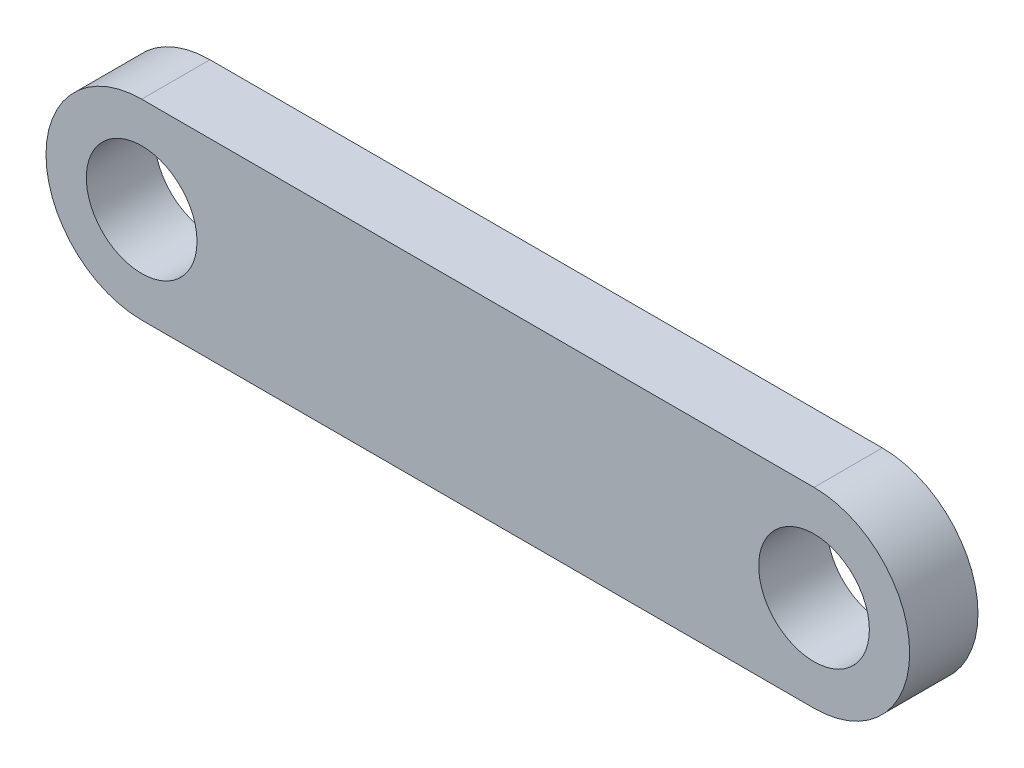
ISO-10303-21;
HEADER;
FILE_DESCRIPTION(('STEP AP214'),'2;1');
FILE_NAME('part.step','',(''),(''),'','','');
FILE_SCHEMA(('AUTOMOTIVE_DESIGN { 1 0 10303 214 1 1 1 1 }'));
ENDSEC;
DATA;
#1=APPLICATION_CONTEXT('core data for automotive mechanical design processes');
#2=APPLICATION_PROTOCOL_DEFINITION('international standard','automotive_design',2000,#1);
#3=PRODUCT_CONTEXT('',#1,'mechanical');
#4=PRODUCT('Part','Part','',(#3));
#5=PRODUCT_RELATED_PRODUCT_CATEGORY('part','',(#4));
#6=PRODUCT_DEFINITION_FORMATION('','',#4);
#7=PRODUCT_DEFINITION_CONTEXT('part definition',#1,'design');
#8=PRODUCT_DEFINITION('design','',#6,#7);
#9=PRODUCT_DEFINITION_SHAPE('','',#8);
#10=(LENGTH_UNIT() NAMED_UNIT(*) SI_UNIT(.MILLI.,.METRE.));
#11=(NAMED_UNIT(*) PLANE_ANGLE_UNIT() SI_UNIT($,.RADIAN.));
#12=(NAMED_UNIT(*) SI_UNIT($,.STERADIAN.) SOLID_ANGLE_UNIT());
#13=UNCERTAINTY_MEASURE_WITH_UNIT(LENGTH_MEASURE(1.E-05),#10,'distance_accuracy_value','');
#14=(GEOMETRIC_REPRESENTATION_CONTEXT(3) GLOBAL_UNCERTAINTY_ASSIGNED_CONTEXT((#13)) GLOBAL_UNIT_ASSIGNED_CONTEXT((#10,
#11,#12)) REPRESENTATION_CONTEXT('',''));
#15=CARTESIAN_POINT('',(0.,0.,0.));
#16=DIRECTION('',(0.,0.,1.));
#17=DIRECTION('',(1.,0.,0.));
#18=AXIS2_PLACEMENT_3D('',#15,#16,#17);
#19=CARTESIAN_POINT('',(0.,-7.,5.));
#20=DIRECTION('',(0.,1.,0.));
#21=DIRECTION('',(0.,0.,1.));
#22=AXIS2_PLACEMENT_3D('',#19,#20,#21);
#23=PLANE('',#22);
#24=DIRECTION('',(1.,0.,0.));
#25=VECTOR('',#24,1.);
#26=CARTESIAN_POINT('',(0.,-7.,0.));
#27=LINE('',#26,#25);
#28=CARTESIAN_POINT('',(0.,-7.,0.));
#29=VERTEX_POINT('',#28);
#30=CARTESIAN_POINT('',(49.2,-7.,0.));
#31=VERTEX_POINT('',#30);
#32=EDGE_CURVE('E106',#29,#31,#27,.T.);
#33=ORIENTED_EDGE('',*,*,#32,.T.);
#34=DIRECTION('',(0.,0.,-1.));
#35=VECTOR('',#34,1.);
#36=CARTESIAN_POINT('',(49.2,-7.,5.));
#37=LINE('',#36,#35);
#38=CARTESIAN_POINT('',(49.2,-7.,5.));
#39=VERTEX_POINT('',#38);
#40=EDGE_CURVE('E11',#39,#31,#37,.T.);
#41=ORIENTED_EDGE('',*,*,#40,.F.);
#42=DIRECTION('',(1.,0.,0.));
#43=VECTOR('',#42,1.);
#44=CARTESIAN_POINT('',(0.,-7.,5.));
#45=LINE('',#44,#43);
#46=CARTESIAN_POINT('',(0.,-7.,5.));
#47=VERTEX_POINT('',#46);
#48=EDGE_CURVE('E88',#47,#39,#45,.T.);
#49=ORIENTED_EDGE('',*,*,#48,.F.);
#50=DIRECTION('',(0.,0.,-1.));
#51=VECTOR('',#50,1.);
#52=CARTESIAN_POINT('',(0.,-7.,5.));
#53=LINE('',#52,#51);
#54=EDGE_CURVE('E105',#47,#29,#53,.T.);
#55=ORIENTED_EDGE('',*,*,#54,.T.);
#56=EDGE_LOOP('',(#33,#41,#49,#55));
#57=FACE_BOUND('',#56,.T.);
#58=ADVANCED_FACE('F36',(#57),#23,.F.);
#59=CARTESIAN_POINT('',(49.2,0.,5.));
#60=DIRECTION('',(0.,0.,-1.));
#61=DIRECTION('',(-1.,0.,0.));
#62=AXIS2_PLACEMENT_3D('',#59,#60,#61);
#63=CYLINDRICAL_SURFACE('',#62,7.);
#64=CARTESIAN_POINT('',(49.2,0.,0.));
#65=DIRECTION('',(0.,0.,1.));
#66=DIRECTION('',(1.,0.,0.));
#67=AXIS2_PLACEMENT_3D('',#64,#65,#66);
#68=CIRCLE('',#67,7.);
#69=CARTESIAN_POINT('',(49.2,7.,0.));
#70=VERTEX_POINT('',#69);
#71=EDGE_CURVE('E92',#31,#70,#68,.T.);
#72=ORIENTED_EDGE('',*,*,#71,.T.);
#73=DIRECTION('',(0.,0.,-1.));
#74=VECTOR('',#73,1.);
#75=CARTESIAN_POINT('',(49.2,7.,5.));
#76=LINE('',#75,#74);
#77=CARTESIAN_POINT('',(49.2,7.,5.));
#78=VERTEX_POINT('',#77);
#79=EDGE_CURVE('E44',#78,#70,#76,.T.);
#80=ORIENTED_EDGE('',*,*,#79,.F.);
#81=CARTESIAN_POINT('',(49.2,0.,5.));
#82=DIRECTION('',(0.,0.,1.));
#83=DIRECTION('',(1.,0.,0.));
#84=AXIS2_PLACEMENT_3D('',#81,#82,#83);
#85=CIRCLE('',#84,7.);
#86=EDGE_CURVE('E82',#39,#78,#85,.T.);
#87=ORIENTED_EDGE('',*,*,#86,.F.);
#88=ORIENTED_EDGE('',*,*,#40,.T.);
#89=EDGE_LOOP('',(#72,#80,#87,#88));
#90=FACE_BOUND('',#89,.T.);
#91=ADVANCED_FACE('F91',(#90),#63,.T.);
#92=CARTESIAN_POINT('',(0.,7.,5.));
#93=DIRECTION('',(0.,-1.,0.));
#94=DIRECTION('',(0.,0.,-1.));
#95=AXIS2_PLACEMENT_3D('',#92,#93,#94);
#96=PLANE('',#95);
#97=DIRECTION('',(-1.,0.,0.));
#98=VECTOR('',#97,1.);
#99=CARTESIAN_POINT('',(0.,7.,0.));
#100=LINE('',#99,#98);
#101=CARTESIAN_POINT('',(0.,7.,0.));
#102=VERTEX_POINT('',#101);
#103=EDGE_CURVE('E69',#70,#102,#100,.T.);
#104=ORIENTED_EDGE('',*,*,#103,.T.);
#105=DIRECTION('',(0.,0.,-1.));
#106=VECTOR('',#105,1.);
#107=CARTESIAN_POINT('',(0.,7.,5.));
#108=LINE('',#107,#106);
#109=CARTESIAN_POINT('',(0.,7.,5.));
#110=VERTEX_POINT('',#109);
#111=EDGE_CURVE('E93',#110,#102,#108,.T.);
#112=ORIENTED_EDGE('',*,*,#111,.F.);
#113=DIRECTION('',(-1.,0.,0.));
#114=VECTOR('',#113,1.);
#115=CARTESIAN_POINT('',(0.,7.,5.));
#116=LINE('',#115,#114);
#117=EDGE_CURVE('E86',#78,#110,#116,.T.);
#118=ORIENTED_EDGE('',*,*,#117,.F.);
#119=ORIENTED_EDGE('',*,*,#79,.T.);
#120=EDGE_LOOP('',(#104,#112,#118,#119));
#121=FACE_BOUND('',#120,.T.);
#122=ADVANCED_FACE('F94',(#121),#96,.F.);
#123=CARTESIAN_POINT('',(0.,0.,5.));
#124=DIRECTION('',(0.,0.,-1.));
#125=DIRECTION('',(-1.,0.,0.));
#126=AXIS2_PLACEMENT_3D('',#123,#124,#125);
#127=CYLINDRICAL_SURFACE('',#126,4.05);
#128=CARTESIAN_POINT('',(0.,0.,5.));
#129=DIRECTION('',(0.,0.,1.));
#130=DIRECTION('',(1.,0.,0.));
#131=AXIS2_PLACEMENT_3D('',#128,#129,#130);
#132=CIRCLE('',#131,4.05);
#133=CARTESIAN_POINT('',(4.05,0.,5.));
#134=VERTEX_POINT('',#133);
#135=EDGE_CURVE('E96',#134,#134,#132,.T.);
#136=ORIENTED_EDGE('',*,*,#135,.T.);
#137=EDGE_LOOP('',(#136));
#138=FACE_BOUND('',#137,.T.);
#139=CARTESIAN_POINT('',(0.,0.,0.));
#140=DIRECTION('',(0.,0.,1.));
#141=DIRECTION('',(1.,0.,0.));
#142=AXIS2_PLACEMENT_3D('',#139,#140,#141);
#143=CIRCLE('',#142,4.05);
#144=CARTESIAN_POINT('',(4.05,0.,0.));
#145=VERTEX_POINT('',#144);
#146=EDGE_CURVE('E112',#145,#145,#143,.T.);
#147=ORIENTED_EDGE('',*,*,#146,.F.);
#148=EDGE_LOOP('',(#147));
#149=FACE_BOUND('',#148,.T.);
#150=ADVANCED_FACE('F132',(#138,#149),#127,.F.);
#151=CARTESIAN_POINT('',(0.,0.,5.));
#152=DIRECTION('',(0.,0.,-1.));
#153=DIRECTION('',(-1.,0.,0.));
#154=AXIS2_PLACEMENT_3D('',#151,#152,#153);
#155=CYLINDRICAL_SURFACE('',#154,7.);
#156=CARTESIAN_POINT('',(0.,0.,0.));
#157=DIRECTION('',(0.,0.,1.));
#158=DIRECTION('',(1.,0.,0.));
#159=AXIS2_PLACEMENT_3D('',#156,#157,#158);
#160=CIRCLE('',#159,7.);
#161=EDGE_CURVE('E75',#102,#29,#160,.T.);
#162=ORIENTED_EDGE('',*,*,#161,.T.);
#163=ORIENTED_EDGE('',*,*,#54,.F.);
#164=CARTESIAN_POINT('',(0.,0.,5.));
#165=DIRECTION('',(0.,0.,1.));
#166=DIRECTION('',(1.,0.,0.));
#167=AXIS2_PLACEMENT_3D('',#164,#165,#166);
#168=CIRCLE('',#167,7.);
#169=EDGE_CURVE('E52',#110,#47,#168,.T.);
#170=ORIENTED_EDGE('',*,*,#169,.F.);
#171=ORIENTED_EDGE('',*,*,#111,.T.);
#172=EDGE_LOOP('',(#162,#163,#170,#171));
#173=FACE_BOUND('',#172,.T.);
#174=ADVANCED_FACE('F119',(#173),#155,.T.);
#175=CARTESIAN_POINT('',(49.2,0.,5.));
#176=DIRECTION('',(0.,0.,-1.));
#177=DIRECTION('',(-1.,0.,0.));
#178=AXIS2_PLACEMENT_3D('',#175,#176,#177);
#179=CYLINDRICAL_SURFACE('',#178,4.05);
#180=CARTESIAN_POINT('',(49.2,0.,5.));
#181=DIRECTION('',(0.,0.,1.));
#182=DIRECTION('',(1.,0.,0.));
#183=AXIS2_PLACEMENT_3D('',#180,#181,#182);
#184=CIRCLE('',#183,4.05);
#185=CARTESIAN_POINT('',(53.25,0.,5.));
#186=VERTEX_POINT('',#185);
#187=EDGE_CURVE('E102',#186,#186,#184,.T.);
#188=ORIENTED_EDGE('',*,*,#187,.T.);
#189=EDGE_LOOP('',(#188));
#190=FACE_BOUND('',#189,.T.);
#191=CARTESIAN_POINT('',(49.2,0.,0.));
#192=DIRECTION('',(0.,0.,1.));
#193=DIRECTION('',(1.,0.,0.));
#194=AXIS2_PLACEMENT_3D('',#191,#192,#193);
#195=CIRCLE('',#194,4.05);
#196=CARTESIAN_POINT('',(53.25,0.,0.));
#197=VERTEX_POINT('',#196);
#198=EDGE_CURVE('E115',#197,#197,#195,.T.);
#199=ORIENTED_EDGE('',*,*,#198,.F.);
#200=EDGE_LOOP('',(#199));
#201=FACE_BOUND('',#200,.T.);
#202=ADVANCED_FACE('F137',(#190,#201),#179,.F.);
#203=CARTESIAN_POINT('',(0.,0.,5.));
#204=DIRECTION('',(0.,0.,1.));
#205=DIRECTION('',(1.,0.,0.));
#206=AXIS2_PLACEMENT_3D('',#203,#204,#205);
#207=PLANE('',#206);
#208=ORIENTED_EDGE('',*,*,#48,.T.);
#209=ORIENTED_EDGE('',*,*,#86,.T.);
#210=ORIENTED_EDGE('',*,*,#117,.T.);
#211=ORIENTED_EDGE('',*,*,#169,.T.);
#212=EDGE_LOOP('',(#208,#209,#210,#211));
#213=FACE_BOUND('',#212,.T.);
#214=ORIENTED_EDGE('',*,*,#135,.F.);
#215=EDGE_LOOP('',(#214));
#216=FACE_BOUND('',#215,.T.);
#217=ORIENTED_EDGE('',*,*,#187,.F.);
#218=EDGE_LOOP('',(#217));
#219=FACE_BOUND('',#218,.T.);
#220=ADVANCED_FACE('F83',(#213,#216,#219),#207,.T.);
#221=CARTESIAN_POINT('',(0.,0.,0.));
#222=DIRECTION('',(0.,0.,1.));
#223=DIRECTION('',(1.,0.,0.));
#224=AXIS2_PLACEMENT_3D('',#221,#222,#223);
#225=PLANE('',#224);
#226=ORIENTED_EDGE('',*,*,#32,.F.);
#227=ORIENTED_EDGE('',*,*,#161,.F.);
#228=ORIENTED_EDGE('',*,*,#103,.F.);
#229=ORIENTED_EDGE('',*,*,#71,.F.);
#230=EDGE_LOOP('',(#226,#227,#228,#229));
#231=FACE_BOUND('',#230,.T.);
#232=ORIENTED_EDGE('',*,*,#146,.T.);
#233=EDGE_LOOP('',(#232));
#234=FACE_BOUND('',#233,.T.);
#235=ORIENTED_EDGE('',*,*,#198,.T.);
#236=EDGE_LOOP('',(#235));
#237=FACE_BOUND('',#236,.T.);
#238=ADVANCED_FACE('F122',(#231,#234,#237),#225,.F.);
#239=CLOSED_SHELL('',(#58,#91,#122,#150,#174,#202,#220,#238));
#240=MANIFOLD_SOLID_BREP('B2',#239);
#241=ADVANCED_BREP_SHAPE_REPRESENTATION('',(#18,#240),#14);
#242=SHAPE_DEFINITION_REPRESENTATION(#9,#241);
ENDSEC;
END-ISO-10303-21;
